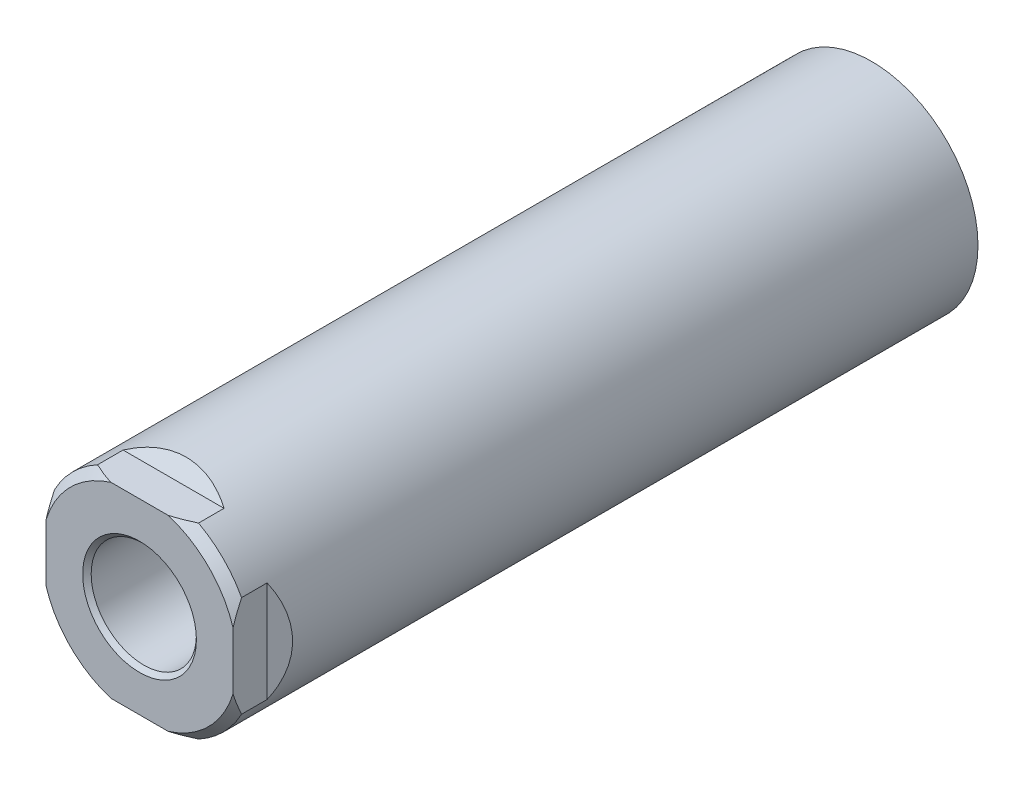
ISO-10303-21;
HEADER;
FILE_DESCRIPTION(('STEP AP214'),'2;1');
FILE_NAME('part.step','',(''),(''),'','','');
FILE_SCHEMA(('AUTOMOTIVE_DESIGN { 1 0 10303 214 1 1 1 1 }'));
ENDSEC;
DATA;
#1=APPLICATION_CONTEXT('core data for automotive mechanical design processes');
#2=APPLICATION_PROTOCOL_DEFINITION('international standard','automotive_design',2000,#1);
#3=PRODUCT_CONTEXT('',#1,'mechanical');
#4=PRODUCT('Part','Part','',(#3));
#5=PRODUCT_RELATED_PRODUCT_CATEGORY('part','',(#4));
#6=PRODUCT_DEFINITION_FORMATION('','',#4);
#7=PRODUCT_DEFINITION_CONTEXT('part definition',#1,'design');
#8=PRODUCT_DEFINITION('design','',#6,#7);
#9=PRODUCT_DEFINITION_SHAPE('','',#8);
#10=(LENGTH_UNIT() NAMED_UNIT(*) SI_UNIT(.MILLI.,.METRE.));
#11=(NAMED_UNIT(*) PLANE_ANGLE_UNIT() SI_UNIT($,.RADIAN.));
#12=(NAMED_UNIT(*) SI_UNIT($,.STERADIAN.) SOLID_ANGLE_UNIT());
#13=UNCERTAINTY_MEASURE_WITH_UNIT(LENGTH_MEASURE(1.E-05),#10,'distance_accuracy_value','');
#14=(GEOMETRIC_REPRESENTATION_CONTEXT(3) GLOBAL_UNCERTAINTY_ASSIGNED_CONTEXT((#13)) GLOBAL_UNIT_ASSIGNED_CONTEXT((#10,
#11,#12)) REPRESENTATION_CONTEXT('',''));
#15=CARTESIAN_POINT('',(0.,0.,0.));
#16=DIRECTION('',(0.,0.,1.));
#17=DIRECTION('',(1.,0.,0.));
#18=AXIS2_PLACEMENT_3D('',#15,#16,#17);
#19=CARTESIAN_POINT('',(2.03349279266518,0.837320591833501,88.6500000000001));
#20=DIRECTION('',(0.,0.,-1.));
#21=DIRECTION('',(-1.,0.,0.));
#22=AXIS2_PLACEMENT_3D('',#19,#20,#21);
#23=CYLINDRICAL_SURFACE('',#22,12.5);
#24=DIRECTION('',(0.,0.,-1.));
#25=VECTOR('',#24,1.);
#26=CARTESIAN_POINT('',(-3.90367825085369,-10.1626794081666,88.6500000000001));
#27=LINE('',#26,#25);
#28=CARTESIAN_POINT('',(-3.90367825085369,-10.1626794081666,88.0000000000001));
#29=VERTEX_POINT('',#28);
#30=CARTESIAN_POINT('',(-3.90367825067983,-10.1626794081666,90.9999999996338));
#31=VERTEX_POINT('',#30);
#32=EDGE_CURVE('E43',#29,#31,#27,.F.);
#33=ORIENTED_EDGE('',*,*,#32,.T.);
#34=CARTESIAN_POINT('',(2.03349279266518,0.837320591833501,91.));
#35=DIRECTION('',(0.,0.,-1.));
#36=DIRECTION('',(-1.,0.,0.));
#37=AXIS2_PLACEMENT_3D('',#34,#35,#36);
#38=CIRCLE('',#37,12.5);
#39=CARTESIAN_POINT('',(-8.96650720733461,-5.09985045168571,90.9999999995512));
#40=VERTEX_POINT('',#39);
#41=EDGE_CURVE('E12',#31,#40,#38,.T.);
#42=ORIENTED_EDGE('',*,*,#41,.T.);
#43=DIRECTION('',(0.,0.,-1.));
#44=VECTOR('',#43,1.);
#45=CARTESIAN_POINT('',(-8.96650720733461,-5.09985045168571,88.6500000000001));
#46=LINE('',#45,#44);
#47=CARTESIAN_POINT('',(-8.96650720733461,-5.09985045168571,88.0000000000001));
#48=VERTEX_POINT('',#47);
#49=EDGE_CURVE('E246',#40,#48,#46,.T.);
#50=ORIENTED_EDGE('',*,*,#49,.T.);
#51=CARTESIAN_POINT('',(2.03349279266518,0.837320591833501,99.0000000000002));
#52=DIRECTION('',(0.70710678118655,0.,-0.707106781186545));
#53=DIRECTION('',(-0.707106781186545,0.,-0.70710678118655));
#54=AXIS2_PLACEMENT_3D('',#51,#52,#53);
#55=ELLIPSE('',#54,17.6776695296637,12.5);
#56=CARTESIAN_POINT('',(-8.96650720733438,6.77449163535271,88.0000000000001));
#57=VERTEX_POINT('',#56);
#58=EDGE_CURVE('E247',#48,#57,#55,.T.);
#59=ORIENTED_EDGE('',*,*,#58,.T.);
#60=DIRECTION('',(0.,0.,-1.));
#61=VECTOR('',#60,1.);
#62=CARTESIAN_POINT('',(-8.96650720733438,6.77449163535271,88.6500000000001));
#63=LINE('',#62,#61);
#64=CARTESIAN_POINT('',(-8.96650720733483,6.77449163517863,90.9999999996338));
#65=VERTEX_POINT('',#64);
#66=EDGE_CURVE('E250',#57,#65,#63,.F.);
#67=ORIENTED_EDGE('',*,*,#66,.T.);
#68=CARTESIAN_POINT('',(2.03349279266518,0.837320591833501,91.));
#69=DIRECTION('',(0.,0.,-1.));
#70=DIRECTION('',(-1.,0.,0.));
#71=AXIS2_PLACEMENT_3D('',#68,#69,#70);
#72=CIRCLE('',#71,12.5);
#73=CARTESIAN_POINT('',(-3.90367825067961,11.8373205918336,90.9999999996338));
#74=VERTEX_POINT('',#73);
#75=EDGE_CURVE('E151',#65,#74,#72,.T.);
#76=ORIENTED_EDGE('',*,*,#75,.T.);
#77=DIRECTION('',(0.,0.,-1.));
#78=VECTOR('',#77,1.);
#79=CARTESIAN_POINT('',(-3.90367825085325,11.8373205918343,88.6500000000001));
#80=LINE('',#79,#78);
#81=CARTESIAN_POINT('',(-3.90367825085325,11.8373205918343,88.0000000000001));
#82=VERTEX_POINT('',#81);
#83=EDGE_CURVE('E255',#74,#82,#80,.T.);
#84=ORIENTED_EDGE('',*,*,#83,.T.);
#85=CARTESIAN_POINT('',(2.03349279266518,0.837320591833501,99.0000000000002));
#86=DIRECTION('',(0.,-0.70710678118655,-0.707106781186545));
#87=DIRECTION('',(0.,0.707106781186545,-0.70710678118655));
#88=AXIS2_PLACEMENT_3D('',#85,#86,#87);
#89=ELLIPSE('',#88,17.6776695296637,12.5);
#90=CARTESIAN_POINT('',(7.9706638361845,11.8373205918341,88.0000000000001));
#91=VERTEX_POINT('',#90);
#92=EDGE_CURVE('E251',#82,#91,#89,.T.);
#93=ORIENTED_EDGE('',*,*,#92,.T.);
#94=DIRECTION('',(0.,0.,-1.));
#95=VECTOR('',#94,1.);
#96=CARTESIAN_POINT('',(7.9706638361845,11.8373205918341,88.6500000000001));
#97=LINE('',#96,#95);
#98=CARTESIAN_POINT('',(7.97066383601031,11.8373205918336,90.999999999634));
#99=VERTEX_POINT('',#98);
#100=EDGE_CURVE('E254',#91,#99,#97,.F.);
#101=ORIENTED_EDGE('',*,*,#100,.T.);
#102=CARTESIAN_POINT('',(2.03349279266518,0.837320591833501,91.));
#103=DIRECTION('',(0.,0.,-1.));
#104=DIRECTION('',(-1.,0.,0.));
#105=AXIS2_PLACEMENT_3D('',#102,#103,#104);
#106=CIRCLE('',#105,12.5);
#107=CARTESIAN_POINT('',(13.0334927926656,6.77449163517863,90.9999999996338));
#108=VERTEX_POINT('',#107);
#109=EDGE_CURVE('E280',#99,#108,#106,.T.);
#110=ORIENTED_EDGE('',*,*,#109,.T.);
#111=DIRECTION('',(0.,0.,-1.));
#112=VECTOR('',#111,1.);
#113=CARTESIAN_POINT('',(13.0334927926651,6.77449163535271,88.6500000000001));
#114=LINE('',#113,#112);
#115=CARTESIAN_POINT('',(13.0334927926651,6.77449163535271,88.0000000000001));
#116=VERTEX_POINT('',#115);
#117=EDGE_CURVE('E260',#108,#116,#114,.T.);
#118=ORIENTED_EDGE('',*,*,#117,.T.);
#119=CARTESIAN_POINT('',(2.03349279266518,0.837320591833501,99.0000000000002));
#120=DIRECTION('',(-0.70710678118655,0.,-0.707106781186545));
#121=DIRECTION('',(0.707106781186545,0.,-0.70710678118655));
#122=AXIS2_PLACEMENT_3D('',#119,#120,#121);
#123=ELLIPSE('',#122,17.6776695296637,12.5);
#124=CARTESIAN_POINT('',(13.0334927926653,-5.09985045168504,88.0000000000001));
#125=VERTEX_POINT('',#124);
#126=EDGE_CURVE('E256',#116,#125,#123,.T.);
#127=ORIENTED_EDGE('',*,*,#126,.T.);
#128=DIRECTION('',(0.,0.,-1.));
#129=VECTOR('',#128,1.);
#130=CARTESIAN_POINT('',(13.0334927926653,-5.09985045168504,88.6500000000001));
#131=LINE('',#130,#129);
#132=CARTESIAN_POINT('',(13.0334927926653,-5.09985045151118,90.9999999996338));
#133=VERTEX_POINT('',#132);
#134=EDGE_CURVE('E259',#125,#133,#131,.F.);
#135=ORIENTED_EDGE('',*,*,#134,.T.);
#136=CARTESIAN_POINT('',(2.03349279266518,0.837320591833501,91.));
#137=DIRECTION('',(0.,0.,-1.));
#138=DIRECTION('',(-1.,0.,0.));
#139=AXIS2_PLACEMENT_3D('',#136,#137,#138);
#140=CIRCLE('',#139,12.5);
#141=CARTESIAN_POINT('',(7.97066383601053,-10.1626794081662,90.9999999996338));
#142=VERTEX_POINT('',#141);
#143=EDGE_CURVE('E286',#133,#142,#140,.T.);
#144=ORIENTED_EDGE('',*,*,#143,.T.);
#145=DIRECTION('',(0.,0.,-1.));
#146=VECTOR('',#145,1.);
#147=CARTESIAN_POINT('',(7.97066383618483,-10.1626794081662,88.6500000000001));
#148=LINE('',#147,#146);
#149=CARTESIAN_POINT('',(7.97066383618483,-10.1626794081662,88.0000000000001));
#150=VERTEX_POINT('',#149);
#151=EDGE_CURVE('E264',#142,#150,#148,.T.);
#152=ORIENTED_EDGE('',*,*,#151,.T.);
#153=CARTESIAN_POINT('',(2.03349279266518,0.837320591833501,99.0000000000002));
#154=DIRECTION('',(0.,0.70710678118655,-0.707106781186545));
#155=DIRECTION('',(0.,-0.707106781186545,-0.70710678118655));
#156=AXIS2_PLACEMENT_3D('',#153,#154,#155);
#157=ELLIPSE('',#156,17.6776695296637,12.5);
#158=EDGE_CURVE('E261',#150,#29,#157,.T.);
#159=ORIENTED_EDGE('',*,*,#158,.T.);
#160=EDGE_LOOP('',(#33,#42,#50,#59,#67,#76,#84,#93,#101,#110,#118,#127,#135,#144,#152,#159));
#161=FACE_BOUND('',#160,.T.);
#162=CARTESIAN_POINT('',(2.0334927926654,0.837320591833501,5.90000000000002));
#163=DIRECTION('',(0.,0.,-1.));
#164=DIRECTION('',(-1.,0.,0.));
#165=AXIS2_PLACEMENT_3D('',#162,#163,#164);
#166=CIRCLE('',#165,12.5);
#167=CARTESIAN_POINT('',(-10.4665072073346,0.837320591833501,5.90000000000002));
#168=VERTEX_POINT('',#167);
#169=EDGE_CURVE('E271',#168,#168,#166,.T.);
#170=ORIENTED_EDGE('',*,*,#169,.F.);
#171=EDGE_LOOP('',(#170));
#172=FACE_BOUND('',#171,.T.);
#173=ADVANCED_FACE('F33',(#161,#172),#23,.T.);
#174=CARTESIAN_POINT('',(2.03349279266507,0.837320591833501,72.0000000000001));
#175=DIRECTION('',(0.,0.,1.));
#176=DIRECTION('',(0.,-1.,0.));
#177=AXIS2_PLACEMENT_3D('',#174,#175,#176);
#178=CONICAL_SURFACE('',#177,6.18800000000002,1.02974425867665);
#179=CARTESIAN_POINT('',(2.03349279266507,0.837320591833501,68.2818744894576));
#180=VERTEX_POINT('',#179);
#181=VERTEX_LOOP('',#180);
#182=FACE_BOUND('',#181,.T.);
#183=CARTESIAN_POINT('',(2.03349279266507,0.837320591833501,72.0000000000001));
#184=DIRECTION('',(0.,0.,1.));
#185=DIRECTION('',(0.,-1.,0.));
#186=AXIS2_PLACEMENT_3D('',#183,#184,#185);
#187=CIRCLE('',#186,6.188);
#188=CARTESIAN_POINT('',(2.03349279266507,-5.3506794081665,72.0000000000001));
#189=VERTEX_POINT('',#188);
#190=EDGE_CURVE('E267',#189,#189,#187,.T.);
#191=ORIENTED_EDGE('',*,*,#190,.T.);
#192=EDGE_LOOP('',(#191));
#193=FACE_BOUND('',#192,.T.);
#194=ADVANCED_FACE('F312',(#182,#193),#178,.F.);
#195=CARTESIAN_POINT('',(2.03349279266518,0.837320591833501,91.5000000000001));
#196=DIRECTION('',(0.,0.,-1.));
#197=DIRECTION('',(-1.,0.,0.));
#198=AXIS2_PLACEMENT_3D('',#195,#196,#197);
#199=CYLINDRICAL_SURFACE('',#198,6.188);
#200=CARTESIAN_POINT('',(2.03349279266518,0.837320591833501,91.499999999769));
#201=DIRECTION('',(0.,0.,1.));
#202=DIRECTION('',(-1.,0.,0.));
#203=AXIS2_PLACEMENT_3D('',#200,#201,#202);
#204=CIRCLE('',#203,6.1880000001533);
#205=CARTESIAN_POINT('',(-4.15450720748812,0.837320591833501,91.499999999769));
#206=VERTEX_POINT('',#205);
#207=EDGE_CURVE('E270',#206,#206,#204,.T.);
#208=ORIENTED_EDGE('',*,*,#207,.T.);
#209=EDGE_LOOP('',(#208));
#210=FACE_BOUND('',#209,.T.);
#211=ORIENTED_EDGE('',*,*,#190,.F.);
#212=EDGE_LOOP('',(#211));
#213=FACE_BOUND('',#212,.T.);
#214=ADVANCED_FACE('F35',(#210,#213),#199,.F.);
#215=CARTESIAN_POINT('',(2.03349279266518,0.837320591833501,92.0000000003256));
#216=DIRECTION('',(0.,0.,1.));
#217=DIRECTION('',(1.,0.,0.));
#218=AXIS2_PLACEMENT_3D('',#215,#216,#217);
#219=CONICAL_SURFACE('',#218,6.68799999974358,0.78539816243111);
#220=CARTESIAN_POINT('',(2.03349279266518,0.837320591833501,92.0000000003256));
#221=DIRECTION('',(0.,0.,1.));
#222=DIRECTION('',(1.,0.,0.));
#223=AXIS2_PLACEMENT_3D('',#220,#221,#222);
#224=CIRCLE('',#223,6.68799999974358);
#225=CARTESIAN_POINT('',(8.72149279240876,0.837320591833501,92.0000000003256));
#226=VERTEX_POINT('',#225);
#227=EDGE_CURVE('E37',#226,#226,#224,.F.);
#228=ORIENTED_EDGE('',*,*,#227,.F.);
#229=EDGE_LOOP('',(#228));
#230=FACE_BOUND('',#229,.T.);
#231=ORIENTED_EDGE('',*,*,#207,.F.);
#232=EDGE_LOOP('',(#231));
#233=FACE_BOUND('',#232,.T.);
#234=ADVANCED_FACE('F385',(#230,#233),#219,.F.);
#235=CARTESIAN_POINT('',(2.0334927926654,6.58732059183342,92.0000000000001));
#236=DIRECTION('',(0.,0.,1.));
#237=DIRECTION('',(1.,0.,0.));
#238=AXIS2_PLACEMENT_3D('',#235,#236,#237);
#239=PLANE('',#238);
#240=ORIENTED_EDGE('',*,*,#227,.T.);
#241=EDGE_LOOP('',(#240));
#242=FACE_BOUND('',#241,.T.);
#243=DIRECTION('',(1.,0.,0.));
#244=VECTOR('',#243,1.);
#245=CARTESIAN_POINT('',(2.03349279266574,11.8373205918336,92.0000000000001));
#246=LINE('',#245,#244);
#247=CARTESIAN_POINT('',(5.38759476122275,11.8373205918336,92.0000000002243));
#248=VERTEX_POINT('',#247);
#249=CARTESIAN_POINT('',(-1.32060917589227,11.8373205918336,92.0000000002243));
#250=VERTEX_POINT('',#249);
#251=EDGE_CURVE('E144',#248,#250,#246,.F.);
#252=ORIENTED_EDGE('',*,*,#251,.T.);
#253=CARTESIAN_POINT('',(2.03349279266518,0.837320591833501,92.0000000004488));
#254=DIRECTION('',(0.,0.,-1.));
#255=DIRECTION('',(-1.,0.,0.));
#256=AXIS2_PLACEMENT_3D('',#253,#254,#255);
#257=CIRCLE('',#256,11.5000000004487);
#258=CARTESIAN_POINT('',(-8.96650720733472,4.19142256039162,92.0000000002243));
#259=VERTEX_POINT('',#258);
#260=EDGE_CURVE('E141',#259,#250,#257,.T.);
#261=ORIENTED_EDGE('',*,*,#260,.F.);
#262=DIRECTION('',(0.,1.,0.));
#263=VECTOR('',#262,1.);
#264=CARTESIAN_POINT('',(-8.96650720733449,0.837320591833501,92.0000000000001));
#265=LINE('',#264,#263);
#266=CARTESIAN_POINT('',(-8.96650720733416,-2.51678137607514,92.0000000004135));
#267=VERTEX_POINT('',#266);
#268=EDGE_CURVE('E131',#259,#267,#265,.F.);
#269=ORIENTED_EDGE('',*,*,#268,.T.);
#270=CARTESIAN_POINT('',(2.03349279266518,0.837320591833501,92.0000000004488));
#271=DIRECTION('',(0.,0.,-1.));
#272=DIRECTION('',(-1.,0.,0.));
#273=AXIS2_PLACEMENT_3D('',#270,#271,#272);
#274=CIRCLE('',#273,11.5000000004487);
#275=CARTESIAN_POINT('',(-1.32060917589205,-10.1626794081666,92.0000000002243));
#276=VERTEX_POINT('',#275);
#277=EDGE_CURVE('E244',#276,#267,#274,.T.);
#278=ORIENTED_EDGE('',*,*,#277,.F.);
#279=DIRECTION('',(1.,0.,0.));
#280=VECTOR('',#279,1.);
#281=CARTESIAN_POINT('',(2.03349279266529,-10.1626794081666,92.0000000000001));
#282=LINE('',#281,#280);
#283=CARTESIAN_POINT('',(5.38759476122297,-10.1626794081666,92.0000000002243));
#284=VERTEX_POINT('',#283);
#285=EDGE_CURVE('E225',#276,#284,#282,.T.);
#286=ORIENTED_EDGE('',*,*,#285,.T.);
#287=CARTESIAN_POINT('',(2.03349279266518,0.837320591833501,92.0000000004488));
#288=DIRECTION('',(0.,0.,-1.));
#289=DIRECTION('',(-1.,0.,0.));
#290=AXIS2_PLACEMENT_3D('',#287,#288,#289);
#291=CIRCLE('',#290,11.5000000004487);
#292=CARTESIAN_POINT('',(13.0334927926656,-2.51678137672351,92.0000000002243));
#293=VERTEX_POINT('',#292);
#294=EDGE_CURVE('E231',#293,#284,#291,.T.);
#295=ORIENTED_EDGE('',*,*,#294,.F.);
#296=DIRECTION('',(0.,1.,0.));
#297=VECTOR('',#296,1.);
#298=CARTESIAN_POINT('',(13.0334927926655,0.837320591833501,92.0000000000001));
#299=LINE('',#298,#297);
#300=CARTESIAN_POINT('',(13.0334927926653,4.19142256039096,92.0000000002243));
#301=VERTEX_POINT('',#300);
#302=EDGE_CURVE('E200',#293,#301,#299,.T.);
#303=ORIENTED_EDGE('',*,*,#302,.T.);
#304=CARTESIAN_POINT('',(2.03349279266518,0.837320591833501,92.0000000004488));
#305=DIRECTION('',(0.,0.,-1.));
#306=DIRECTION('',(-1.,0.,0.));
#307=AXIS2_PLACEMENT_3D('',#304,#305,#306);
#308=CIRCLE('',#307,11.5000000004487);
#309=EDGE_CURVE('E206',#248,#301,#308,.T.);
#310=ORIENTED_EDGE('',*,*,#309,.F.);
#311=EDGE_LOOP('',(#252,#261,#269,#278,#286,#295,#303,#310));
#312=FACE_BOUND('',#311,.T.);
#313=ADVANCED_FACE('F142',(#242,#312),#239,.T.);
#314=CARTESIAN_POINT('',(2.03349279266518,-11.6626794081667,86.5));
#315=DIRECTION('',(0.,0.70710678118655,-0.707106781186545));
#316=DIRECTION('',(0.,0.707106781186545,0.70710678118655));
#317=AXIS2_PLACEMENT_3D('',#314,#315,#316);
#318=PLANE('',#317);
#319=DIRECTION('',(1.,0.,0.));
#320=VECTOR('',#319,1.);
#321=CARTESIAN_POINT('',(2.03349279266529,-10.1626794081666,88.0000000000001));
#322=LINE('',#321,#320);
#323=EDGE_CURVE('E289',#150,#29,#322,.F.);
#324=ORIENTED_EDGE('',*,*,#323,.T.);
#325=ORIENTED_EDGE('',*,*,#158,.F.);
#326=EDGE_LOOP('',(#324,#325));
#327=FACE_BOUND('',#326,.T.);
#328=ADVANCED_FACE('F215',(#327),#318,.F.);
#329=CARTESIAN_POINT('',(2.03349279266518,0.837320591833501,90.9999999995512));
#330=DIRECTION('',(0.,0.,-1.));
#331=DIRECTION('',(-1.,0.,0.));
#332=AXIS2_PLACEMENT_3D('',#329,#330,#331);
#333=CONICAL_SURFACE('',#332,12.4999999995513,0.785398162499991);
#334=CARTESIAN_POINT('',(13.0334927928538,-5.0998504513764,90.9999999993501));
#335=CARTESIAN_POINT('',(13.0334927927334,-4.89100121050934,91.0991842970412));
#336=CARTESIAN_POINT('',(13.0334927926837,-4.68056124410337,91.1950976245918));
#337=CARTESIAN_POINT('',(13.0334927926472,-4.25674498807163,91.3792308762462));
#338=CARTESIAN_POINT('',(13.0334927926602,-4.04337388627468,91.467462763863));
#339=CARTESIAN_POINT('',(13.0334927926706,-3.61323128584387,91.635421122357));
#340=CARTESIAN_POINT('',(13.033492792668,-3.39645905221583,91.7151457249191));
#341=CARTESIAN_POINT('',(13.0334927926628,-2.95926517625806,91.8650599015278));
#342=CARTESIAN_POINT('',(13.0334927926601,-2.73883828124365,91.9352341194556));
#343=CARTESIAN_POINT('',(13.0334927926653,-2.51678137466471,92.000000000825));
#344=B_SPLINE_CURVE_WITH_KNOTS('',3,(#334,#335,#336,#337,#338,#339,#340,#341,#342,#343),
.UNSPECIFIED.,.F.,.F.,(4,2,2,2,4),(0.,0.693633730562586,1.38616707311326,2.07885219371433,
2.77263824999346),.UNSPECIFIED.);
#345=EDGE_CURVE('E199',#133,#293,#344,.T.);
#346=ORIENTED_EDGE('',*,*,#345,.T.);
#347=ORIENTED_EDGE('',*,*,#294,.T.);
#348=CARTESIAN_POINT('',(5.38759475914363,-10.1626794080618,92.000000000783));
#349=CARTESIAN_POINT('',(5.60965166573441,-10.1626794081288,91.9352341194435));
#350=CARTESIAN_POINT('',(5.83007856075385,-10.1626794081564,91.8650599015255));
#351=CARTESIAN_POINT('',(6.26727243671608,-10.1626794081768,91.715145724922));
#352=CARTESIAN_POINT('',(6.48404467034357,-10.1626794081695,91.6354211223554));
#353=CARTESIAN_POINT('',(6.91418727077789,-10.1626794081637,91.4674627638626));
#354=CARTESIAN_POINT('',(7.12755837257889,-10.1626794081652,91.3792308762516));
#355=CARTESIAN_POINT('',(7.55137462860694,-10.1626794081681,91.1950976245807));
#356=CARTESIAN_POINT('',(7.76181459500512,-10.1626794081695,91.0991842970079));
#357=CARTESIAN_POINT('',(7.97066383584966,-10.1626794081666,90.9999999992614));
#358=B_SPLINE_CURVE_WITH_KNOTS('',3,(#348,#349,#350,#351,#352,#353,#354,#355,#356,#357),
.UNSPECIFIED.,.F.,.F.,(4,2,2,2,4),(0.,0.693786056285007,1.38647117688908,2.0790045194439,
2.77263825001315),.UNSPECIFIED.);
#359=EDGE_CURVE('E220',#284,#142,#358,.T.);
#360=ORIENTED_EDGE('',*,*,#359,.T.);
#361=ORIENTED_EDGE('',*,*,#143,.F.);
#362=EDGE_LOOP('',(#346,#347,#360,#361));
#363=FACE_BOUND('',#362,.T.);
#364=ADVANCED_FACE('F210',(#363),#333,.T.);
#365=CARTESIAN_POINT('',(14.5334927926647,0.837320591833945,86.5));
#366=DIRECTION('',(-0.70710678118655,0.,-0.707106781186545));
#367=DIRECTION('',(-0.707106781186545,0.,0.70710678118655));
#368=AXIS2_PLACEMENT_3D('',#365,#366,#367);
#369=PLANE('',#368);
#370=DIRECTION('',(0.,1.,0.));
#371=VECTOR('',#370,1.);
#372=CARTESIAN_POINT('',(13.0334927926654,0.837320591833501,88.0000000000001));
#373=LINE('',#372,#371);
#374=EDGE_CURVE('E283',#116,#125,#373,.F.);
#375=ORIENTED_EDGE('',*,*,#374,.T.);
#376=ORIENTED_EDGE('',*,*,#126,.F.);
#377=EDGE_LOOP('',(#375,#376));
#378=FACE_BOUND('',#377,.T.);
#379=ADVANCED_FACE('F190',(#378),#369,.F.);
#380=CARTESIAN_POINT('',(13.0334927926654,0.837320591833501,88.0000000000001));
#381=DIRECTION('',(-1.,0.,0.));
#382=DIRECTION('',(0.,0.,1.));
#383=AXIS2_PLACEMENT_3D('',#380,#381,#382);
#384=PLANE('',#383);
#385=CARTESIAN_POINT('',(13.0334927925611,4.19142255831217,92.000000000783));
#386=CARTESIAN_POINT('',(13.0334927926278,4.41347946490289,91.9352341194434));
#387=CARTESIAN_POINT('',(13.0334927926553,4.63390635992229,91.8650599015254));
#388=CARTESIAN_POINT('',(13.0334927926755,5.07110023588445,91.7151457249219));
#389=CARTESIAN_POINT('',(13.0334927926683,5.28787246951192,91.6354211223553));
#390=CARTESIAN_POINT('',(13.0334927926625,5.7180150699462,91.4674627638625));
#391=CARTESIAN_POINT('',(13.033492792664,5.93138617174718,91.3792308762515));
#392=CARTESIAN_POINT('',(13.0334927926668,6.35520242777518,91.1950976245807));
#393=CARTESIAN_POINT('',(13.0334927926682,6.56564239417335,91.0991842970079));
#394=CARTESIAN_POINT('',(13.0334927926651,6.77449163501787,90.9999999992614));
#395=B_SPLINE_CURVE_WITH_KNOTS('',3,(#385,#386,#387,#388,#389,#390,#391,#392,#393,#394),
.UNSPECIFIED.,.F.,.F.,(4,2,2,2,4),(0.,0.693786056284918,1.38647117688892,2.07900451944367,
2.77263825001283),.UNSPECIFIED.);
#396=EDGE_CURVE('E194',#301,#108,#395,.T.);
#397=ORIENTED_EDGE('',*,*,#396,.F.);
#398=ORIENTED_EDGE('',*,*,#302,.F.);
#399=ORIENTED_EDGE('',*,*,#345,.F.);
#400=ORIENTED_EDGE('',*,*,#134,.F.);
#401=ORIENTED_EDGE('',*,*,#374,.F.);
#402=ORIENTED_EDGE('',*,*,#117,.F.);
#403=EDGE_LOOP('',(#397,#398,#399,#400,#401,#402));
#404=FACE_BOUND('',#403,.T.);
#405=ADVANCED_FACE('F188',(#404),#384,.F.);
#406=CARTESIAN_POINT('',(2.03349279266518,0.837320591833501,90.9999999995512));
#407=DIRECTION('',(0.,0.,-1.));
#408=DIRECTION('',(-1.,0.,0.));
#409=AXIS2_PLACEMENT_3D('',#406,#407,#408);
#410=CONICAL_SURFACE('',#409,12.4999999995513,0.785398162499991);
#411=CARTESIAN_POINT('',(7.97066383587575,11.8373205920224,90.9999999993501));
#412=CARTESIAN_POINT('',(7.76181459500861,11.8373205919017,91.0991842970411));
#413=CARTESIAN_POINT('',(7.5513746286026,11.8373205918519,91.1950976245917));
#414=CARTESIAN_POINT('',(7.12755837257081,11.8373205918153,91.379230876246));
#415=CARTESIAN_POINT('',(6.91418727077385,11.8373205918284,91.4674627638629));
#416=CARTESIAN_POINT('',(6.484044670343,11.8373205918388,91.6354211223569));
#417=CARTESIAN_POINT('',(6.26727243671494,11.8373205918362,91.715145724919));
#418=CARTESIAN_POINT('',(5.83007856075712,11.837320591831,91.8650599015278));
#419=CARTESIAN_POINT('',(5.60965166574269,11.8373205918284,91.9352341194556));
#420=CARTESIAN_POINT('',(5.38759475916373,11.8373205918336,92.000000000825));
#421=B_SPLINE_CURVE_WITH_KNOTS('',3,(#411,#412,#413,#414,#415,#416,#417,#418,#419,#420),
.UNSPECIFIED.,.F.,.F.,(4,2,2,2,4),(0.,0.693633730562658,1.38616707311341,2.07885219371455,
2.77263824999376),.UNSPECIFIED.);
#422=EDGE_CURVE('E174',#99,#248,#421,.T.);
#423=ORIENTED_EDGE('',*,*,#422,.T.);
#424=ORIENTED_EDGE('',*,*,#309,.T.);
#425=ORIENTED_EDGE('',*,*,#396,.T.);
#426=ORIENTED_EDGE('',*,*,#109,.F.);
#427=EDGE_LOOP('',(#423,#424,#425,#426));
#428=FACE_BOUND('',#427,.T.);
#429=ADVANCED_FACE('F183',(#428),#410,.T.);
#430=CARTESIAN_POINT('',(2.03349279266496,13.3373205918337,86.5));
#431=DIRECTION('',(0.,-0.70710678118655,-0.707106781186545));
#432=DIRECTION('',(0.,0.707106781186545,-0.70710678118655));
#433=AXIS2_PLACEMENT_3D('',#430,#431,#432);
#434=PLANE('',#433);
#435=DIRECTION('',(1.,0.,0.));
#436=VECTOR('',#435,1.);
#437=CARTESIAN_POINT('',(2.03349279266574,11.8373205918336,88.0000000000001));
#438=LINE('',#437,#436);
#439=EDGE_CURVE('E147',#82,#91,#438,.T.);
#440=ORIENTED_EDGE('',*,*,#439,.T.);
#441=ORIENTED_EDGE('',*,*,#92,.F.);
#442=EDGE_LOOP('',(#440,#441));
#443=FACE_BOUND('',#442,.T.);
#444=ADVANCED_FACE('F166',(#443),#434,.F.);
#445=CARTESIAN_POINT('',(2.03349279266574,11.8373205918336,88.0000000000001));
#446=DIRECTION('',(0.,-1.,0.));
#447=DIRECTION('',(0.,0.,-1.));
#448=AXIS2_PLACEMENT_3D('',#445,#446,#447);
#449=PLANE('',#448);
#450=CARTESIAN_POINT('',(-1.32060917381283,11.8373205917288,92.000000000783));
#451=CARTESIAN_POINT('',(-1.54266608040366,11.8373205917958,91.9352341194436));
#452=CARTESIAN_POINT('',(-1.76309297542313,11.8373205918234,91.8650599015256));
#453=CARTESIAN_POINT('',(-2.20028685138542,11.8373205918438,91.7151457249221));
#454=CARTESIAN_POINT('',(-2.41705908501294,11.8373205918365,91.6354211223555));
#455=CARTESIAN_POINT('',(-2.84720168544731,11.8373205918307,91.4674627638627));
#456=CARTESIAN_POINT('',(-3.06057278724834,11.8373205918321,91.3792308762516));
#457=CARTESIAN_POINT('',(-3.48438904327644,11.8373205918351,91.1950976245808));
#458=CARTESIAN_POINT('',(-3.69482900967464,11.8373205918366,91.099184297008));
#459=CARTESIAN_POINT('',(-3.90367825051918,11.8373205918338,90.9999999992614));
#460=B_SPLINE_CURVE_WITH_KNOTS('',3,(#450,#451,#452,#453,#454,#455,#456,#457,#458,#459),
.UNSPECIFIED.,.F.,.F.,(4,2,2,2,4),(0.,0.693786056285093,1.38647117688925,2.07900451944415,
2.77263825001347),.UNSPECIFIED.);
#461=EDGE_CURVE('E169',#250,#74,#460,.T.);
#462=ORIENTED_EDGE('',*,*,#461,.F.);
#463=ORIENTED_EDGE('',*,*,#251,.F.);
#464=ORIENTED_EDGE('',*,*,#422,.F.);
#465=ORIENTED_EDGE('',*,*,#100,.F.);
#466=ORIENTED_EDGE('',*,*,#439,.F.);
#467=ORIENTED_EDGE('',*,*,#83,.F.);
#468=EDGE_LOOP('',(#462,#463,#464,#465,#466,#467));
#469=FACE_BOUND('',#468,.T.);
#470=ADVANCED_FACE('F165',(#469),#449,.F.);
#471=CARTESIAN_POINT('',(2.03349279266518,0.837320591833501,90.9999999995512));
#472=DIRECTION('',(0.,0.,-1.));
#473=DIRECTION('',(-1.,0.,0.));
#474=AXIS2_PLACEMENT_3D('',#471,#472,#473);
#475=CONICAL_SURFACE('',#474,12.4999999995513,0.785398162499991);
#476=ORIENTED_EDGE('',*,*,#461,.T.);
#477=ORIENTED_EDGE('',*,*,#75,.F.);
#478=CARTESIAN_POINT('',(-8.96650720752312,6.77449163504362,90.9999999993501));
#479=CARTESIAN_POINT('',(-8.96650720740256,6.56564239417662,91.0991842970415));
#480=CARTESIAN_POINT('',(-8.96650720735281,6.35520242777065,91.1950976245921));
#481=CARTESIAN_POINT('',(-8.96650720731621,5.93138617173888,91.3792308762466));
#482=CARTESIAN_POINT('',(-8.96650720732927,5.71801506994188,91.4674627638634));
#483=CARTESIAN_POINT('',(-8.96650720733972,5.28787246951102,91.6354211223575));
#484=CARTESIAN_POINT('',(-8.96650720733711,5.07110023588296,91.7151457249196));
#485=CARTESIAN_POINT('',(-8.96650720733188,4.63390635992509,91.8650599015283));
#486=CARTESIAN_POINT('',(-8.96650720732925,4.41347946491059,91.935234119456));
#487=CARTESIAN_POINT('',(-8.96650720733449,4.19142255833149,92.000000000825));
#488=B_SPLINE_CURVE_WITH_KNOTS('',3,(#478,#479,#480,#481,#482,#483,#484,#485,#486,#487),
.UNSPECIFIED.,.F.,.F.,(4,2,2,2,4),(0.,0.693633730562716,1.38616707311349,2.07885219371466,
2.77263824999393),.UNSPECIFIED.);
#489=EDGE_CURVE('E109',#65,#259,#488,.T.);
#490=ORIENTED_EDGE('',*,*,#489,.T.);
#491=ORIENTED_EDGE('',*,*,#260,.T.);
#492=EDGE_LOOP('',(#476,#477,#490,#491));
#493=FACE_BOUND('',#492,.T.);
#494=ADVANCED_FACE('F149',(#493),#475,.T.);
#495=CARTESIAN_POINT('',(-10.4665072073353,0.837320591834168,86.5));
#496=DIRECTION('',(0.70710678118655,0.,-0.707106781186545));
#497=DIRECTION('',(-0.707106781186545,0.,-0.70710678118655));
#498=AXIS2_PLACEMENT_3D('',#495,#496,#497);
#499=PLANE('',#498);
#500=DIRECTION('',(0.,1.,0.));
#501=VECTOR('',#500,1.);
#502=CARTESIAN_POINT('',(-8.96650720733449,0.837320591833501,88.0000000000001));
#503=LINE('',#502,#501);
#504=EDGE_CURVE('E115',#48,#57,#503,.T.);
#505=ORIENTED_EDGE('',*,*,#504,.T.);
#506=ORIENTED_EDGE('',*,*,#58,.F.);
#507=EDGE_LOOP('',(#505,#506));
#508=FACE_BOUND('',#507,.T.);
#509=ADVANCED_FACE('F164',(#508),#499,.F.);
#510=CARTESIAN_POINT('',(-8.96650720733449,0.837320591833501,88.0000000000001));
#511=DIRECTION('',(1.,0.,0.));
#512=DIRECTION('',(0.,0.,-1.));
#513=AXIS2_PLACEMENT_3D('',#510,#511,#512);
#514=PLANE('',#513);
#515=CARTESIAN_POINT('',(-8.96650720722991,-2.51678137464473,92.000000000783));
#516=CARTESIAN_POINT('',(-8.96650720729675,-2.73883828123561,91.9352341194438));
#517=CARTESIAN_POINT('',(-8.96650720732434,-2.9592651762551,91.8650599015259));
#518=CARTESIAN_POINT('',(-8.96650720734464,-3.39645905221738,91.7151457249225));
#519=CARTESIAN_POINT('',(-8.9665072073374,-3.61323128584487,91.6354211223558));
#520=CARTESIAN_POINT('',(-8.96650720733159,-4.0433738862792,91.467462763863));
#521=CARTESIAN_POINT('',(-8.96650720733301,-4.25674498808023,91.379230876252));
#522=CARTESIAN_POINT('',(-8.96650720733598,-4.68056124410827,91.1950976245811));
#523=CARTESIAN_POINT('',(-8.96650720733752,-4.89100121050643,91.0991842970082));
#524=CARTESIAN_POINT('',(-8.96650720733483,-5.09985045135086,90.9999999992614));
#525=B_SPLINE_CURVE_WITH_KNOTS('',3,(#515,#516,#517,#518,#519,#520,#521,#522,#523,#524),
.UNSPECIFIED.,.F.,.F.,(4,2,2,2,4),(0.,0.693786056285052,1.38647117688917,2.07900451944401,
2.77263825001331),.UNSPECIFIED.);
#526=EDGE_CURVE('E135',#267,#40,#525,.T.);
#527=ORIENTED_EDGE('',*,*,#526,.F.);
#528=ORIENTED_EDGE('',*,*,#268,.F.);
#529=ORIENTED_EDGE('',*,*,#489,.F.);
#530=ORIENTED_EDGE('',*,*,#66,.F.);
#531=ORIENTED_EDGE('',*,*,#504,.F.);
#532=ORIENTED_EDGE('',*,*,#49,.F.);
#533=EDGE_LOOP('',(#527,#528,#529,#530,#531,#532));
#534=FACE_BOUND('',#533,.T.);
#535=ADVANCED_FACE('F133',(#534),#514,.F.);
#536=CARTESIAN_POINT('',(2.03349279266518,0.837320591833501,90.9999999995512));
#537=DIRECTION('',(0.,0.,-1.));
#538=DIRECTION('',(-1.,0.,0.));
#539=AXIS2_PLACEMENT_3D('',#536,#537,#538);
#540=CONICAL_SURFACE('',#539,12.4999999995513,0.785398162499991);
#541=CARTESIAN_POINT('',(-3.90367825054483,-10.1626794083549,90.9999999993501));
#542=CARTESIAN_POINT('',(-3.69482900967773,-10.1626794082346,91.0991842970413));
#543=CARTESIAN_POINT('',(-3.48438904327171,-10.1626794081849,91.1950976245919));
#544=CARTESIAN_POINT('',(-3.06057278723988,-10.1626794081484,91.3792308762463));
#545=CARTESIAN_POINT('',(-2.84720168544288,-10.1626794081614,91.4674627638631));
#546=CARTESIAN_POINT('',(-2.41705908501198,-10.1626794081718,91.6354211223572));
#547=CARTESIAN_POINT('',(-2.2002868513839,-10.1626794081692,91.7151457249193));
#548=CARTESIAN_POINT('',(-1.76309297542601,-10.162679408164,91.865059901528));
#549=CARTESIAN_POINT('',(-1.54266608041152,-10.1626794081614,91.9352341194558));
#550=CARTESIAN_POINT('',(-1.32060917383248,-10.1626794081666,92.000000000825));
#551=B_SPLINE_CURVE_WITH_KNOTS('',3,(#541,#542,#543,#544,#545,#546,#547,#548,#549,#550),
.UNSPECIFIED.,.F.,.F.,(4,2,2,2,4),(0.,0.69363373056275,1.38616707311358,2.0788521937148,
2.7726382499941),.UNSPECIFIED.);
#552=EDGE_CURVE('E52',#31,#276,#551,.T.);
#553=ORIENTED_EDGE('',*,*,#552,.T.);
#554=ORIENTED_EDGE('',*,*,#277,.T.);
#555=ORIENTED_EDGE('',*,*,#526,.T.);
#556=ORIENTED_EDGE('',*,*,#41,.F.);
#557=EDGE_LOOP('',(#553,#554,#555,#556));
#558=FACE_BOUND('',#557,.T.);
#559=ADVANCED_FACE('F236',(#558),#540,.T.);
#560=CARTESIAN_POINT('',(2.03349279266529,-10.1626794081666,88.0000000000001));
#561=DIRECTION('',(0.,1.,0.));
#562=DIRECTION('',(0.,0.,1.));
#563=AXIS2_PLACEMENT_3D('',#560,#561,#562);
#564=PLANE('',#563);
#565=ORIENTED_EDGE('',*,*,#359,.F.);
#566=ORIENTED_EDGE('',*,*,#285,.F.);
#567=ORIENTED_EDGE('',*,*,#552,.F.);
#568=ORIENTED_EDGE('',*,*,#32,.F.);
#569=ORIENTED_EDGE('',*,*,#323,.F.);
#570=ORIENTED_EDGE('',*,*,#151,.F.);
#571=EDGE_LOOP('',(#565,#566,#567,#568,#569,#570));
#572=FACE_BOUND('',#571,.T.);
#573=ADVANCED_FACE('F232',(#572),#564,.F.);
#574=CARTESIAN_POINT('',(2.0334927926654,0.837320591833501,5.90000000000002));
#575=DIRECTION('',(0.,0.,-1.));
#576=DIRECTION('',(-1.,0.,0.));
#577=AXIS2_PLACEMENT_3D('',#574,#575,#576);
#578=PLANE('',#577);
#579=ORIENTED_EDGE('',*,*,#169,.T.);
#580=EDGE_LOOP('',(#579));
#581=FACE_BOUND('',#580,.T.);
#582=ADVANCED_FACE('F235',(#581),#578,.T.);
#583=CLOSED_SHELL('',(#173,#194,#214,#234,#313,#328,#364,#379,#405,#429,#444,#470,#494,#509,
#535,#559,#573,#582));
#584=MANIFOLD_SOLID_BREP('B2',#583);
#585=ADVANCED_BREP_SHAPE_REPRESENTATION('',(#18,#584),#14);
#586=SHAPE_DEFINITION_REPRESENTATION(#9,#585);
ENDSEC;
END-ISO-10303-21;
